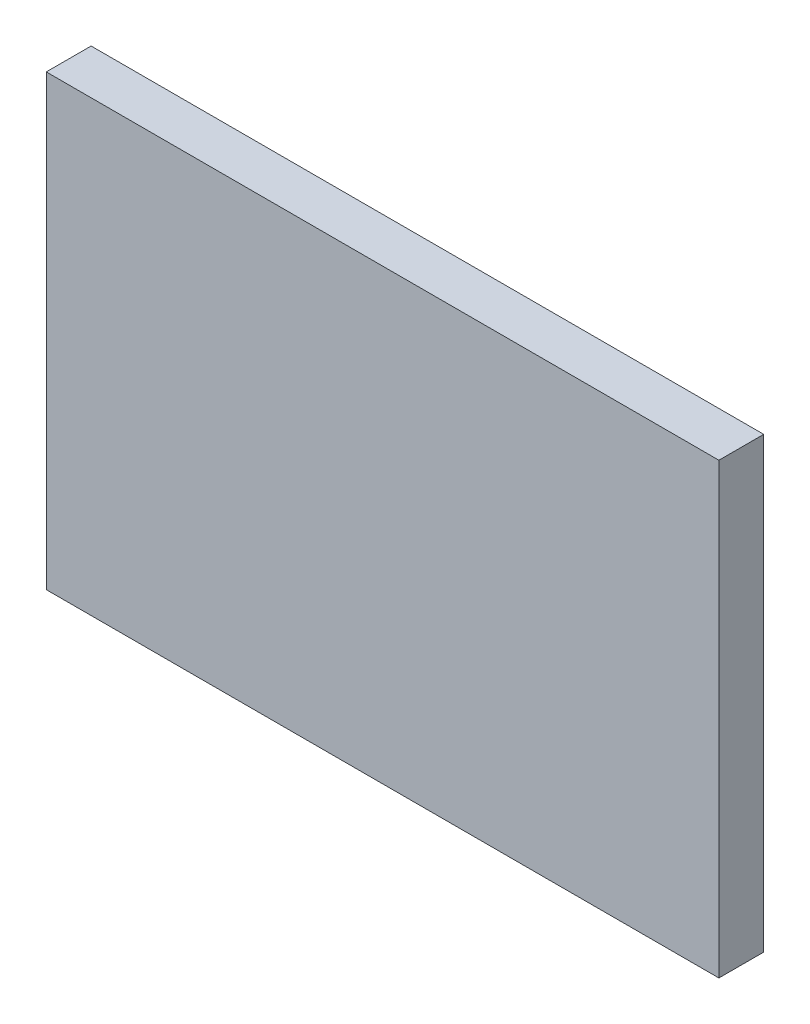
ISO-10303-21;
HEADER;
FILE_DESCRIPTION(('STEP AP214'),'2;1');
FILE_NAME('part.step','',(''),(''),'','','');
FILE_SCHEMA(('AUTOMOTIVE_DESIGN { 1 0 10303 214 1 1 1 1 }'));
ENDSEC;
DATA;
#1=APPLICATION_CONTEXT('core data for automotive mechanical design processes');
#2=APPLICATION_PROTOCOL_DEFINITION('international standard','automotive_design',2000,#1);
#3=PRODUCT_CONTEXT('',#1,'mechanical');
#4=PRODUCT('Part','Part','',(#3));
#5=PRODUCT_RELATED_PRODUCT_CATEGORY('part','',(#4));
#6=PRODUCT_DEFINITION_FORMATION('','',#4);
#7=PRODUCT_DEFINITION_CONTEXT('part definition',#1,'design');
#8=PRODUCT_DEFINITION('design','',#6,#7);
#9=PRODUCT_DEFINITION_SHAPE('','',#8);
#10=(LENGTH_UNIT() NAMED_UNIT(*) SI_UNIT(.MILLI.,.METRE.));
#11=(NAMED_UNIT(*) PLANE_ANGLE_UNIT() SI_UNIT($,.RADIAN.));
#12=(NAMED_UNIT(*) SI_UNIT($,.STERADIAN.) SOLID_ANGLE_UNIT());
#13=UNCERTAINTY_MEASURE_WITH_UNIT(LENGTH_MEASURE(1.E-05),#10,'distance_accuracy_value','');
#14=(GEOMETRIC_REPRESENTATION_CONTEXT(3) GLOBAL_UNCERTAINTY_ASSIGNED_CONTEXT((#13)) GLOBAL_UNIT_ASSIGNED_CONTEXT((#10,
#11,#12)) REPRESENTATION_CONTEXT('',''));
#15=CARTESIAN_POINT('',(0.,0.,0.));
#16=DIRECTION('',(0.,0.,1.));
#17=DIRECTION('',(1.,0.,0.));
#18=AXIS2_PLACEMENT_3D('',#15,#16,#17);
#19=CARTESIAN_POINT('',(30.,0.,2.));
#20=DIRECTION('',(0.,1.,0.));
#21=DIRECTION('',(-1.,0.,0.));
#22=AXIS2_PLACEMENT_3D('',#19,#20,#21);
#23=PLANE('',#22);
#24=DIRECTION('',(1.,0.,0.));
#25=VECTOR('',#24,1.);
#26=CARTESIAN_POINT('',(30.,0.,0.));
#27=LINE('',#26,#25);
#28=CARTESIAN_POINT('',(0.,0.,0.));
#29=VERTEX_POINT('',#28);
#30=CARTESIAN_POINT('',(30.,0.,0.));
#31=VERTEX_POINT('',#30);
#32=EDGE_CURVE('E98',#29,#31,#27,.T.);
#33=ORIENTED_EDGE('',*,*,#32,.T.);
#34=DIRECTION('',(0.,0.,-1.));
#35=VECTOR('',#34,1.);
#36=CARTESIAN_POINT('',(30.,0.,2.));
#37=LINE('',#36,#35);
#38=CARTESIAN_POINT('',(30.,0.,2.));
#39=VERTEX_POINT('',#38);
#40=EDGE_CURVE('E11',#39,#31,#37,.T.);
#41=ORIENTED_EDGE('',*,*,#40,.F.);
#42=DIRECTION('',(1.,0.,0.));
#43=VECTOR('',#42,1.);
#44=CARTESIAN_POINT('',(30.,0.,2.));
#45=LINE('',#44,#43);
#46=CARTESIAN_POINT('',(0.,0.,2.));
#47=VERTEX_POINT('',#46);
#48=EDGE_CURVE('E86',#47,#39,#45,.T.);
#49=ORIENTED_EDGE('',*,*,#48,.F.);
#50=DIRECTION('',(0.,0.,-1.));
#51=VECTOR('',#50,1.);
#52=CARTESIAN_POINT('',(0.,0.,2.));
#53=LINE('',#52,#51);
#54=EDGE_CURVE('E94',#47,#29,#53,.T.);
#55=ORIENTED_EDGE('',*,*,#54,.T.);
#56=EDGE_LOOP('',(#33,#41,#49,#55));
#57=FACE_BOUND('',#56,.T.);
#58=ADVANCED_FACE('F35',(#57),#23,.F.);
#59=CARTESIAN_POINT('',(29.9999999999999,20.,2.));
#60=DIRECTION('',(-1.,0.,0.));
#61=DIRECTION('',(0.,-1.,0.));
#62=AXIS2_PLACEMENT_3D('',#59,#60,#61);
#63=PLANE('',#62);
#64=DIRECTION('',(0.,1.,0.));
#65=VECTOR('',#64,1.);
#66=CARTESIAN_POINT('',(29.9999999999999,20.,0.));
#67=LINE('',#66,#65);
#68=CARTESIAN_POINT('',(29.9999999999999,20.,0.));
#69=VERTEX_POINT('',#68);
#70=EDGE_CURVE('E90',#31,#69,#67,.T.);
#71=ORIENTED_EDGE('',*,*,#70,.T.);
#72=DIRECTION('',(0.,0.,-1.));
#73=VECTOR('',#72,1.);
#74=CARTESIAN_POINT('',(29.9999999999999,20.,2.));
#75=LINE('',#74,#73);
#76=CARTESIAN_POINT('',(29.9999999999999,20.,2.));
#77=VERTEX_POINT('',#76);
#78=EDGE_CURVE('E43',#77,#69,#75,.T.);
#79=ORIENTED_EDGE('',*,*,#78,.F.);
#80=DIRECTION('',(0.,1.,0.));
#81=VECTOR('',#80,1.);
#82=CARTESIAN_POINT('',(29.9999999999999,20.,2.));
#83=LINE('',#82,#81);
#84=EDGE_CURVE('E81',#39,#77,#83,.T.);
#85=ORIENTED_EDGE('',*,*,#84,.F.);
#86=ORIENTED_EDGE('',*,*,#40,.T.);
#87=EDGE_LOOP('',(#71,#79,#85,#86));
#88=FACE_BOUND('',#87,.T.);
#89=ADVANCED_FACE('F89',(#88),#63,.F.);
#90=CARTESIAN_POINT('',(0.,20.,2.));
#91=DIRECTION('',(0.,-1.,0.));
#92=DIRECTION('',(0.,0.,-1.));
#93=AXIS2_PLACEMENT_3D('',#90,#91,#92);
#94=PLANE('',#93);
#95=DIRECTION('',(-1.,0.,0.));
#96=VECTOR('',#95,1.);
#97=CARTESIAN_POINT('',(0.,20.,0.));
#98=LINE('',#97,#96);
#99=CARTESIAN_POINT('',(0.,20.,0.));
#100=VERTEX_POINT('',#99);
#101=EDGE_CURVE('E68',#69,#100,#98,.T.);
#102=ORIENTED_EDGE('',*,*,#101,.T.);
#103=DIRECTION('',(0.,0.,-1.));
#104=VECTOR('',#103,1.);
#105=CARTESIAN_POINT('',(0.,20.,2.));
#106=LINE('',#105,#104);
#107=CARTESIAN_POINT('',(0.,20.,2.));
#108=VERTEX_POINT('',#107);
#109=EDGE_CURVE('E91',#108,#100,#106,.T.);
#110=ORIENTED_EDGE('',*,*,#109,.F.);
#111=DIRECTION('',(-1.,0.,0.));
#112=VECTOR('',#111,1.);
#113=CARTESIAN_POINT('',(0.,20.,2.));
#114=LINE('',#113,#112);
#115=EDGE_CURVE('E84',#77,#108,#114,.T.);
#116=ORIENTED_EDGE('',*,*,#115,.F.);
#117=ORIENTED_EDGE('',*,*,#78,.T.);
#118=EDGE_LOOP('',(#102,#110,#116,#117));
#119=FACE_BOUND('',#118,.T.);
#120=ADVANCED_FACE('F92',(#119),#94,.F.);
#121=CARTESIAN_POINT('',(0.,0.,2.));
#122=DIRECTION('',(1.,0.,0.));
#123=DIRECTION('',(0.,1.,0.));
#124=AXIS2_PLACEMENT_3D('',#121,#122,#123);
#125=PLANE('',#124);
#126=DIRECTION('',(0.,-1.,0.));
#127=VECTOR('',#126,1.);
#128=CARTESIAN_POINT('',(0.,0.,0.));
#129=LINE('',#128,#127);
#130=EDGE_CURVE('E74',#100,#29,#129,.T.);
#131=ORIENTED_EDGE('',*,*,#130,.T.);
#132=ORIENTED_EDGE('',*,*,#54,.F.);
#133=DIRECTION('',(0.,-1.,0.));
#134=VECTOR('',#133,1.);
#135=CARTESIAN_POINT('',(0.,0.,2.));
#136=LINE('',#135,#134);
#137=EDGE_CURVE('E51',#108,#47,#136,.T.);
#138=ORIENTED_EDGE('',*,*,#137,.F.);
#139=ORIENTED_EDGE('',*,*,#109,.T.);
#140=EDGE_LOOP('',(#131,#132,#138,#139));
#141=FACE_BOUND('',#140,.T.);
#142=ADVANCED_FACE('F105',(#141),#125,.F.);
#143=CARTESIAN_POINT('',(0.,0.,2.));
#144=DIRECTION('',(0.,0.,-1.));
#145=DIRECTION('',(-1.,0.,0.));
#146=AXIS2_PLACEMENT_3D('',#143,#144,#145);
#147=PLANE('',#146);
#148=ORIENTED_EDGE('',*,*,#48,.T.);
#149=ORIENTED_EDGE('',*,*,#84,.T.);
#150=ORIENTED_EDGE('',*,*,#115,.T.);
#151=ORIENTED_EDGE('',*,*,#137,.T.);
#152=EDGE_LOOP('',(#148,#149,#150,#151));
#153=FACE_BOUND('',#152,.T.);
#154=ADVANCED_FACE('F82',(#153),#147,.F.);
#155=CARTESIAN_POINT('',(0.,0.,0.));
#156=DIRECTION('',(0.,0.,-1.));
#157=DIRECTION('',(-1.,0.,0.));
#158=AXIS2_PLACEMENT_3D('',#155,#156,#157);
#159=PLANE('',#158);
#160=ORIENTED_EDGE('',*,*,#32,.F.);
#161=ORIENTED_EDGE('',*,*,#130,.F.);
#162=ORIENTED_EDGE('',*,*,#101,.F.);
#163=ORIENTED_EDGE('',*,*,#70,.F.);
#164=EDGE_LOOP('',(#160,#161,#162,#163));
#165=FACE_BOUND('',#164,.T.);
#166=ADVANCED_FACE('F108',(#165),#159,.T.);
#167=CLOSED_SHELL('',(#58,#89,#120,#142,#154,#166));
#168=MANIFOLD_SOLID_BREP('B2',#167);
#169=ADVANCED_BREP_SHAPE_REPRESENTATION('',(#18,#168),#14);
#170=SHAPE_DEFINITION_REPRESENTATION(#9,#169);
ENDSEC;
END-ISO-10303-21;
